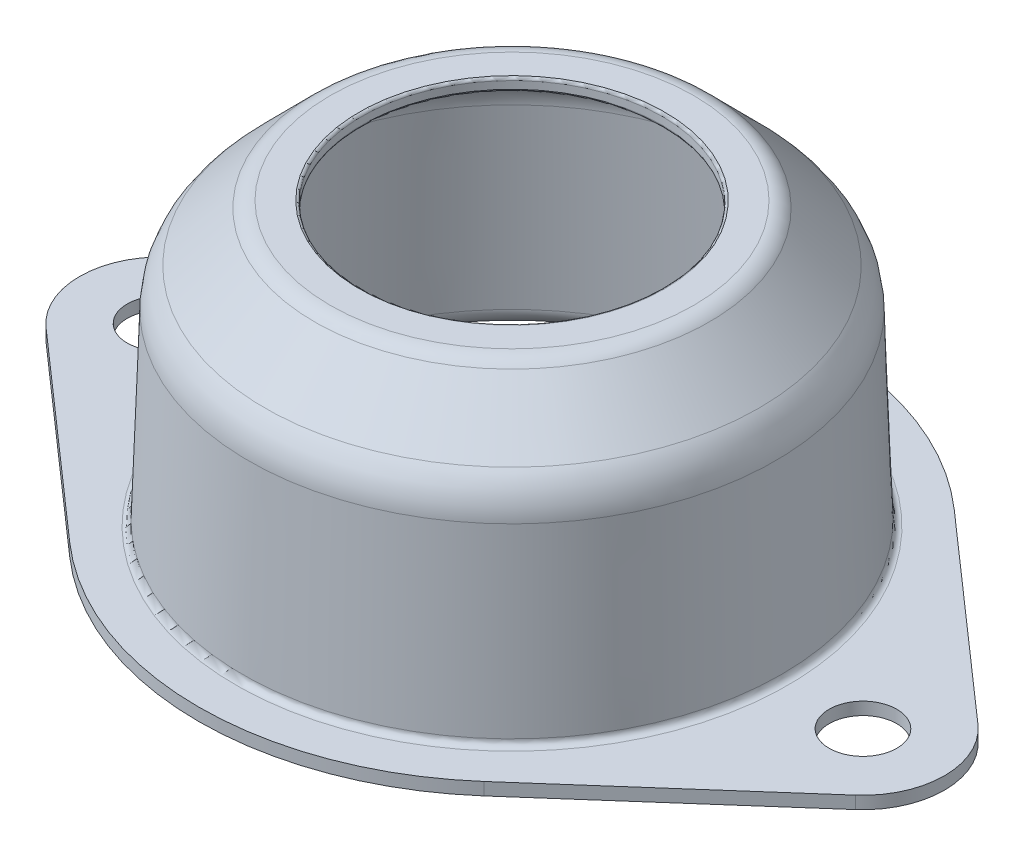
ISO-10303-21;
HEADER;
FILE_DESCRIPTION(('STEP AP214'),'2;1');
FILE_NAME('part.step','',(''),(''),'','','');
FILE_SCHEMA(('AUTOMOTIVE_DESIGN { 1 0 10303 214 1 1 1 1 }'));
ENDSEC;
DATA;
#1=APPLICATION_CONTEXT('core data for automotive mechanical design processes');
#2=APPLICATION_PROTOCOL_DEFINITION('international standard','automotive_design',2000,#1);
#3=PRODUCT_CONTEXT('',#1,'mechanical');
#4=PRODUCT('Part','Part','',(#3));
#5=PRODUCT_RELATED_PRODUCT_CATEGORY('part','',(#4));
#6=PRODUCT_DEFINITION_FORMATION('','',#4);
#7=PRODUCT_DEFINITION_CONTEXT('part definition',#1,'design');
#8=PRODUCT_DEFINITION('design','',#6,#7);
#9=PRODUCT_DEFINITION_SHAPE('','',#8);
#10=(LENGTH_UNIT() NAMED_UNIT(*) SI_UNIT(.MILLI.,.METRE.));
#11=(NAMED_UNIT(*) PLANE_ANGLE_UNIT() SI_UNIT($,.RADIAN.));
#12=(NAMED_UNIT(*) SI_UNIT($,.STERADIAN.) SOLID_ANGLE_UNIT());
#13=UNCERTAINTY_MEASURE_WITH_UNIT(LENGTH_MEASURE(1.E-05),#10,'distance_accuracy_value','');
#14=(GEOMETRIC_REPRESENTATION_CONTEXT(3) GLOBAL_UNCERTAINTY_ASSIGNED_CONTEXT((#13)) GLOBAL_UNIT_ASSIGNED_CONTEXT((#10,
#11,#12)) REPRESENTATION_CONTEXT('',''));
#15=CARTESIAN_POINT('',(0.,0.,0.));
#16=DIRECTION('',(0.,0.,1.));
#17=DIRECTION('',(1.,0.,0.));
#18=AXIS2_PLACEMENT_3D('',#15,#16,#17);
#19=CARTESIAN_POINT('',(0.,1.,0.));
#20=DIRECTION('',(0.,1.,0.));
#21=DIRECTION('',(0.,0.,1.));
#22=AXIS2_PLACEMENT_3D('',#19,#20,#21);
#23=PLANE('',#22);
#24=CARTESIAN_POINT('',(0.,1.,0.));
#25=DIRECTION('',(0.,1.,0.));
#26=DIRECTION('',(-1.,0.,0.));
#27=AXIS2_PLACEMENT_3D('',#24,#25,#26);
#28=CIRCLE('',#27,22.0000000000001);
#29=CARTESIAN_POINT('',(-22.0000000000001,0.999999999999997,0.));
#30=VERTEX_POINT('',#29);
#31=EDGE_CURVE('E199',#30,#30,#28,.T.);
#32=ORIENTED_EDGE('',*,*,#31,.F.);
#33=EDGE_LOOP('',(#32));
#34=FACE_BOUND('',#33,.T.);
#35=CARTESIAN_POINT('',(-28.,1.,0.));
#36=DIRECTION('',(0.,1.,0.));
#37=DIRECTION('',(0.,0.,1.));
#38=AXIS2_PLACEMENT_3D('',#35,#36,#37);
#39=CIRCLE('',#38,2.7);
#40=CARTESIAN_POINT('',(-28.,1.,2.7));
#41=VERTEX_POINT('',#40);
#42=EDGE_CURVE('E163',#41,#41,#39,.T.);
#43=ORIENTED_EDGE('',*,*,#42,.F.);
#44=EDGE_LOOP('',(#43));
#45=FACE_BOUND('',#44,.T.);
#46=CARTESIAN_POINT('',(0.,1.,0.));
#47=DIRECTION('',(0.,1.,0.));
#48=DIRECTION('',(0.,0.,1.));
#49=AXIS2_PLACEMENT_3D('',#46,#47,#48);
#50=CIRCLE('',#49,25.);
#51=CARTESIAN_POINT('',(16.5178571428571,1.,-18.7659371044497));
#52=VERTEX_POINT('',#51);
#53=CARTESIAN_POINT('',(-16.5178571428571,1.,-18.7659371044497));
#54=VERTEX_POINT('',#53);
#55=EDGE_CURVE('E180',#52,#54,#50,.T.);
#56=ORIENTED_EDGE('',*,*,#55,.T.);
#57=DIRECTION('',(-0.75063748417799,0.,0.660714285714285));
#58=VECTOR('',#57,1.);
#59=CARTESIAN_POINT('',(-16.5178571428571,1.,-18.7659371044497));
#60=LINE('',#59,#58);
#61=CARTESIAN_POINT('',(-32.2946428571429,1.,-4.87914364715695));
#62=VERTEX_POINT('',#61);
#63=EDGE_CURVE('E114',#54,#62,#60,.T.);
#64=ORIENTED_EDGE('',*,*,#63,.T.);
#65=CARTESIAN_POINT('',(-28.,1.,0.));
#66=DIRECTION('',(0.,1.,0.));
#67=DIRECTION('',(0.,0.,1.));
#68=AXIS2_PLACEMENT_3D('',#65,#66,#67);
#69=CIRCLE('',#68,6.50000000000002);
#70=CARTESIAN_POINT('',(-32.2946428571429,1.,4.87914364715695));
#71=VERTEX_POINT('',#70);
#72=EDGE_CURVE('E277',#62,#71,#69,.T.);
#73=ORIENTED_EDGE('',*,*,#72,.T.);
#74=DIRECTION('',(0.75063748417799,0.,0.660714285714285));
#75=VECTOR('',#74,1.);
#76=CARTESIAN_POINT('',(-32.2946428571429,1.,4.87914364715695));
#77=LINE('',#76,#75);
#78=CARTESIAN_POINT('',(-16.5178571428571,1.,18.7659371044497));
#79=VERTEX_POINT('',#78);
#80=EDGE_CURVE('E280',#71,#79,#77,.T.);
#81=ORIENTED_EDGE('',*,*,#80,.T.);
#82=CARTESIAN_POINT('',(0.,1.,0.));
#83=DIRECTION('',(0.,1.,0.));
#84=DIRECTION('',(0.,0.,1.));
#85=AXIS2_PLACEMENT_3D('',#82,#83,#84);
#86=CIRCLE('',#85,25.);
#87=CARTESIAN_POINT('',(16.5178571428571,1.,18.7659371044497));
#88=VERTEX_POINT('',#87);
#89=EDGE_CURVE('E136',#79,#88,#86,.T.);
#90=ORIENTED_EDGE('',*,*,#89,.T.);
#91=DIRECTION('',(0.75063748417799,0.,-0.660714285714285));
#92=VECTOR('',#91,1.);
#93=CARTESIAN_POINT('',(16.5178571428571,1.,18.7659371044497));
#94=LINE('',#93,#92);
#95=CARTESIAN_POINT('',(32.2946428571429,1.,4.87914364715695));
#96=VERTEX_POINT('',#95);
#97=EDGE_CURVE('E130',#88,#96,#94,.T.);
#98=ORIENTED_EDGE('',*,*,#97,.T.);
#99=CARTESIAN_POINT('',(28.,1.,0.));
#100=DIRECTION('',(0.,1.,0.));
#101=DIRECTION('',(0.,0.,-1.));
#102=AXIS2_PLACEMENT_3D('',#99,#100,#101);
#103=CIRCLE('',#102,6.50000000000002);
#104=CARTESIAN_POINT('',(32.2946428571429,1.,-4.87914364715695));
#105=VERTEX_POINT('',#104);
#106=EDGE_CURVE('E134',#96,#105,#103,.T.);
#107=ORIENTED_EDGE('',*,*,#106,.T.);
#108=DIRECTION('',(-0.75063748417799,0.,-0.660714285714285));
#109=VECTOR('',#108,1.);
#110=CARTESIAN_POINT('',(32.2946428571429,1.,-4.87914364715695));
#111=LINE('',#110,#109);
#112=EDGE_CURVE('E66',#105,#52,#111,.T.);
#113=ORIENTED_EDGE('',*,*,#112,.T.);
#114=EDGE_LOOP('',(#56,#64,#73,#81,#90,#98,#107,#113));
#115=FACE_BOUND('',#114,.T.);
#116=CARTESIAN_POINT('',(28.,1.,0.));
#117=DIRECTION('',(0.,1.,0.));
#118=DIRECTION('',(0.,0.,1.));
#119=AXIS2_PLACEMENT_3D('',#116,#117,#118);
#120=CIRCLE('',#119,2.7);
#121=CARTESIAN_POINT('',(28.,1.,2.7));
#122=VERTEX_POINT('',#121);
#123=EDGE_CURVE('E259',#122,#122,#120,.T.);
#124=ORIENTED_EDGE('',*,*,#123,.F.);
#125=EDGE_LOOP('',(#124));
#126=FACE_BOUND('',#125,.T.);
#127=ADVANCED_FACE('F45',(#34,#45,#115,#126),#23,.T.);
#128=CARTESIAN_POINT('',(0.,0.,0.));
#129=DIRECTION('',(0.,1.,0.));
#130=DIRECTION('',(0.,0.,1.));
#131=AXIS2_PLACEMENT_3D('',#128,#129,#130);
#132=PLANE('',#131);
#133=CARTESIAN_POINT('',(0.,0.,0.));
#134=DIRECTION('',(0.,-1.,0.));
#135=DIRECTION('',(0.,0.,-1.));
#136=AXIS2_PLACEMENT_3D('',#133,#134,#135);
#137=CIRCLE('',#136,22.0000000000001);
#138=CARTESIAN_POINT('',(0.,0.,-22.0000000000001));
#139=VERTEX_POINT('',#138);
#140=EDGE_CURVE('E377',#139,#139,#137,.T.);
#141=ORIENTED_EDGE('',*,*,#140,.F.);
#142=EDGE_LOOP('',(#141));
#143=FACE_BOUND('',#142,.T.);
#144=CARTESIAN_POINT('',(0.,0.,0.));
#145=DIRECTION('',(0.,1.,0.));
#146=DIRECTION('',(0.,0.,1.));
#147=AXIS2_PLACEMENT_3D('',#144,#145,#146);
#148=CIRCLE('',#147,25.);
#149=CARTESIAN_POINT('',(16.5178571428571,0.,-18.7659371044497));
#150=VERTEX_POINT('',#149);
#151=CARTESIAN_POINT('',(-16.5178571428571,0.,-18.7659371044497));
#152=VERTEX_POINT('',#151);
#153=EDGE_CURVE('E158',#150,#152,#148,.T.);
#154=ORIENTED_EDGE('',*,*,#153,.F.);
#155=DIRECTION('',(-0.75063748417799,0.,-0.660714285714285));
#156=VECTOR('',#155,1.);
#157=CARTESIAN_POINT('',(32.2946428571429,0.,-4.87914364715695));
#158=LINE('',#157,#156);
#159=CARTESIAN_POINT('',(32.2946428571429,0.,-4.87914364715695));
#160=VERTEX_POINT('',#159);
#161=EDGE_CURVE('E105',#160,#150,#158,.T.);
#162=ORIENTED_EDGE('',*,*,#161,.F.);
#163=CARTESIAN_POINT('',(28.,0.,0.));
#164=DIRECTION('',(0.,1.,0.));
#165=DIRECTION('',(0.,0.,-1.));
#166=AXIS2_PLACEMENT_3D('',#163,#164,#165);
#167=CIRCLE('',#166,6.50000000000002);
#168=CARTESIAN_POINT('',(32.2946428571429,0.,4.87914364715695));
#169=VERTEX_POINT('',#168);
#170=EDGE_CURVE('E99',#169,#160,#167,.T.);
#171=ORIENTED_EDGE('',*,*,#170,.F.);
#172=DIRECTION('',(0.75063748417799,0.,-0.660714285714285));
#173=VECTOR('',#172,1.);
#174=CARTESIAN_POINT('',(16.5178571428571,0.,18.7659371044497));
#175=LINE('',#174,#173);
#176=CARTESIAN_POINT('',(16.5178571428571,0.,18.7659371044497));
#177=VERTEX_POINT('',#176);
#178=EDGE_CURVE('E145',#177,#169,#175,.T.);
#179=ORIENTED_EDGE('',*,*,#178,.F.);
#180=CARTESIAN_POINT('',(0.,0.,0.));
#181=DIRECTION('',(0.,1.,0.));
#182=DIRECTION('',(0.,0.,1.));
#183=AXIS2_PLACEMENT_3D('',#180,#181,#182);
#184=CIRCLE('',#183,25.);
#185=CARTESIAN_POINT('',(-16.5178571428571,0.,18.7659371044497));
#186=VERTEX_POINT('',#185);
#187=EDGE_CURVE('E171',#186,#177,#184,.T.);
#188=ORIENTED_EDGE('',*,*,#187,.F.);
#189=DIRECTION('',(0.75063748417799,0.,0.660714285714285));
#190=VECTOR('',#189,1.);
#191=CARTESIAN_POINT('',(-32.2946428571429,0.,4.87914364715695));
#192=LINE('',#191,#190);
#193=CARTESIAN_POINT('',(-32.2946428571429,0.,4.87914364715695));
#194=VERTEX_POINT('',#193);
#195=EDGE_CURVE('E169',#194,#186,#192,.T.);
#196=ORIENTED_EDGE('',*,*,#195,.F.);
#197=CARTESIAN_POINT('',(-28.,0.,0.));
#198=DIRECTION('',(0.,1.,0.));
#199=DIRECTION('',(0.,0.,1.));
#200=AXIS2_PLACEMENT_3D('',#197,#198,#199);
#201=CIRCLE('',#200,6.50000000000002);
#202=CARTESIAN_POINT('',(-32.2946428571429,0.,-4.87914364715695));
#203=VERTEX_POINT('',#202);
#204=EDGE_CURVE('E166',#203,#194,#201,.T.);
#205=ORIENTED_EDGE('',*,*,#204,.F.);
#206=DIRECTION('',(-0.75063748417799,0.,0.660714285714285));
#207=VECTOR('',#206,1.);
#208=CARTESIAN_POINT('',(-16.5178571428571,0.,-18.7659371044497));
#209=LINE('',#208,#207);
#210=EDGE_CURVE('E162',#152,#203,#209,.T.);
#211=ORIENTED_EDGE('',*,*,#210,.F.);
#212=EDGE_LOOP('',(#154,#162,#171,#179,#188,#196,#205,#211));
#213=FACE_BOUND('',#212,.T.);
#214=CARTESIAN_POINT('',(-28.,0.,0.));
#215=DIRECTION('',(0.,1.,0.));
#216=DIRECTION('',(0.,0.,1.));
#217=AXIS2_PLACEMENT_3D('',#214,#215,#216);
#218=CIRCLE('',#217,2.7);
#219=CARTESIAN_POINT('',(-28.,0.,2.7));
#220=VERTEX_POINT('',#219);
#221=EDGE_CURVE('E263',#220,#220,#218,.T.);
#222=ORIENTED_EDGE('',*,*,#221,.T.);
#223=EDGE_LOOP('',(#222));
#224=FACE_BOUND('',#223,.T.);
#225=CARTESIAN_POINT('',(28.,0.,0.));
#226=DIRECTION('',(0.,1.,0.));
#227=DIRECTION('',(0.,0.,1.));
#228=AXIS2_PLACEMENT_3D('',#225,#226,#227);
#229=CIRCLE('',#228,2.7);
#230=CARTESIAN_POINT('',(28.,0.,2.7));
#231=VERTEX_POINT('',#230);
#232=EDGE_CURVE('E258',#231,#231,#229,.T.);
#233=ORIENTED_EDGE('',*,*,#232,.T.);
#234=EDGE_LOOP('',(#233));
#235=FACE_BOUND('',#234,.T.);
#236=ADVANCED_FACE('F294',(#143,#213,#224,#235),#132,.F.);
#237=CARTESIAN_POINT('',(0.,1.,0.));
#238=DIRECTION('',(0.,-1.,0.));
#239=DIRECTION('',(0.,0.,-1.));
#240=AXIS2_PLACEMENT_3D('',#237,#238,#239);
#241=CYLINDRICAL_SURFACE('',#240,25.);
#242=ORIENTED_EDGE('',*,*,#153,.T.);
#243=DIRECTION('',(0.,-1.,0.));
#244=VECTOR('',#243,1.);
#245=CARTESIAN_POINT('',(-16.5178571428571,1.,-18.7659371044497));
#246=LINE('',#245,#244);
#247=EDGE_CURVE('E196',#54,#152,#246,.T.);
#248=ORIENTED_EDGE('',*,*,#247,.F.);
#249=ORIENTED_EDGE('',*,*,#55,.F.);
#250=DIRECTION('',(0.,-1.,0.));
#251=VECTOR('',#250,1.);
#252=CARTESIAN_POINT('',(16.5178571428571,1.,-18.7659371044497));
#253=LINE('',#252,#251);
#254=EDGE_CURVE('E154',#52,#150,#253,.T.);
#255=ORIENTED_EDGE('',*,*,#254,.T.);
#256=EDGE_LOOP('',(#242,#248,#249,#255));
#257=FACE_BOUND('',#256,.T.);
#258=ADVANCED_FACE('F299',(#257),#241,.T.);
#259=CARTESIAN_POINT('',(-16.5178571428571,1.,-18.7659371044497));
#260=DIRECTION('',(0.660714285714285,0.,0.75063748417799));
#261=DIRECTION('',(0.75063748417799,0.,-0.660714285714285));
#262=AXIS2_PLACEMENT_3D('',#259,#260,#261);
#263=PLANE('',#262);
#264=ORIENTED_EDGE('',*,*,#210,.T.);
#265=DIRECTION('',(0.,-1.,0.));
#266=VECTOR('',#265,1.);
#267=CARTESIAN_POINT('',(-32.2946428571429,1.,-4.87914364715695));
#268=LINE('',#267,#266);
#269=EDGE_CURVE('E192',#62,#203,#268,.T.);
#270=ORIENTED_EDGE('',*,*,#269,.F.);
#271=ORIENTED_EDGE('',*,*,#63,.F.);
#272=ORIENTED_EDGE('',*,*,#247,.T.);
#273=EDGE_LOOP('',(#264,#270,#271,#272));
#274=FACE_BOUND('',#273,.T.);
#275=ADVANCED_FACE('F555',(#274),#263,.F.);
#276=CARTESIAN_POINT('',(-28.,1.,0.));
#277=DIRECTION('',(0.,-1.,0.));
#278=DIRECTION('',(0.,0.,-1.));
#279=AXIS2_PLACEMENT_3D('',#276,#277,#278);
#280=CYLINDRICAL_SURFACE('',#279,6.50000000000002);
#281=ORIENTED_EDGE('',*,*,#204,.T.);
#282=DIRECTION('',(0.,-1.,0.));
#283=VECTOR('',#282,1.);
#284=CARTESIAN_POINT('',(-32.2946428571429,1.,4.87914364715695));
#285=LINE('',#284,#283);
#286=EDGE_CURVE('E189',#71,#194,#285,.T.);
#287=ORIENTED_EDGE('',*,*,#286,.F.);
#288=ORIENTED_EDGE('',*,*,#72,.F.);
#289=ORIENTED_EDGE('',*,*,#269,.T.);
#290=EDGE_LOOP('',(#281,#287,#288,#289));
#291=FACE_BOUND('',#290,.T.);
#292=ADVANCED_FACE('F546',(#291),#280,.T.);
#293=CARTESIAN_POINT('',(-32.2946428571429,1.,4.87914364715695));
#294=DIRECTION('',(0.660714285714285,0.,-0.75063748417799));
#295=DIRECTION('',(-0.75063748417799,0.,-0.660714285714285));
#296=AXIS2_PLACEMENT_3D('',#293,#294,#295);
#297=PLANE('',#296);
#298=ORIENTED_EDGE('',*,*,#195,.T.);
#299=DIRECTION('',(0.,-1.,0.));
#300=VECTOR('',#299,1.);
#301=CARTESIAN_POINT('',(-16.5178571428571,1.,18.7659371044497));
#302=LINE('',#301,#300);
#303=EDGE_CURVE('E186',#79,#186,#302,.T.);
#304=ORIENTED_EDGE('',*,*,#303,.F.);
#305=ORIENTED_EDGE('',*,*,#80,.F.);
#306=ORIENTED_EDGE('',*,*,#286,.T.);
#307=EDGE_LOOP('',(#298,#304,#305,#306));
#308=FACE_BOUND('',#307,.T.);
#309=ADVANCED_FACE('F287',(#308),#297,.F.);
#310=CARTESIAN_POINT('',(0.,1.,0.));
#311=DIRECTION('',(0.,-1.,0.));
#312=DIRECTION('',(0.,0.,-1.));
#313=AXIS2_PLACEMENT_3D('',#310,#311,#312);
#314=CYLINDRICAL_SURFACE('',#313,25.);
#315=ORIENTED_EDGE('',*,*,#187,.T.);
#316=DIRECTION('',(0.,-1.,0.));
#317=VECTOR('',#316,1.);
#318=CARTESIAN_POINT('',(16.5178571428571,1.,18.7659371044497));
#319=LINE('',#318,#317);
#320=EDGE_CURVE('E147',#88,#177,#319,.T.);
#321=ORIENTED_EDGE('',*,*,#320,.F.);
#322=ORIENTED_EDGE('',*,*,#89,.F.);
#323=ORIENTED_EDGE('',*,*,#303,.T.);
#324=EDGE_LOOP('',(#315,#321,#322,#323));
#325=FACE_BOUND('',#324,.T.);
#326=ADVANCED_FACE('F291',(#325),#314,.T.);
#327=CARTESIAN_POINT('',(16.5178571428571,1.,18.7659371044497));
#328=DIRECTION('',(-0.660714285714285,0.,-0.75063748417799));
#329=DIRECTION('',(-0.75063748417799,0.,0.660714285714285));
#330=AXIS2_PLACEMENT_3D('',#327,#328,#329);
#331=PLANE('',#330);
#332=ORIENTED_EDGE('',*,*,#178,.T.);
#333=DIRECTION('',(0.,-1.,0.));
#334=VECTOR('',#333,1.);
#335=CARTESIAN_POINT('',(32.2946428571429,1.,4.87914364715695));
#336=LINE('',#335,#334);
#337=EDGE_CURVE('E142',#96,#169,#336,.T.);
#338=ORIENTED_EDGE('',*,*,#337,.F.);
#339=ORIENTED_EDGE('',*,*,#97,.F.);
#340=ORIENTED_EDGE('',*,*,#320,.T.);
#341=EDGE_LOOP('',(#332,#338,#339,#340));
#342=FACE_BOUND('',#341,.T.);
#343=ADVANCED_FACE('F143',(#342),#331,.F.);
#344=CARTESIAN_POINT('',(28.,1.,0.));
#345=DIRECTION('',(0.,-1.,0.));
#346=DIRECTION('',(0.,0.,-1.));
#347=AXIS2_PLACEMENT_3D('',#344,#345,#346);
#348=CYLINDRICAL_SURFACE('',#347,6.50000000000002);
#349=ORIENTED_EDGE('',*,*,#170,.T.);
#350=DIRECTION('',(0.,-1.,0.));
#351=VECTOR('',#350,1.);
#352=CARTESIAN_POINT('',(32.2946428571429,1.,-4.87914364715695));
#353=LINE('',#352,#351);
#354=EDGE_CURVE('E148',#105,#160,#353,.T.);
#355=ORIENTED_EDGE('',*,*,#354,.F.);
#356=ORIENTED_EDGE('',*,*,#106,.F.);
#357=ORIENTED_EDGE('',*,*,#337,.T.);
#358=EDGE_LOOP('',(#349,#355,#356,#357));
#359=FACE_BOUND('',#358,.T.);
#360=ADVANCED_FACE('F150',(#359),#348,.T.);
#361=CARTESIAN_POINT('',(32.2946428571429,1.,-4.87914364715695));
#362=DIRECTION('',(-0.660714285714285,0.,0.75063748417799));
#363=DIRECTION('',(0.75063748417799,0.,0.660714285714285));
#364=AXIS2_PLACEMENT_3D('',#361,#362,#363);
#365=PLANE('',#364);
#366=ORIENTED_EDGE('',*,*,#161,.T.);
#367=ORIENTED_EDGE('',*,*,#254,.F.);
#368=ORIENTED_EDGE('',*,*,#112,.F.);
#369=ORIENTED_EDGE('',*,*,#354,.T.);
#370=EDGE_LOOP('',(#366,#367,#368,#369));
#371=FACE_BOUND('',#370,.T.);
#372=ADVANCED_FACE('F301',(#371),#365,.F.);
#373=CARTESIAN_POINT('',(-28.,1.,0.));
#374=DIRECTION('',(0.,-1.,0.));
#375=DIRECTION('',(0.,0.,-1.));
#376=AXIS2_PLACEMENT_3D('',#373,#374,#375);
#377=CYLINDRICAL_SURFACE('',#376,2.7);
#378=ORIENTED_EDGE('',*,*,#42,.T.);
#379=EDGE_LOOP('',(#378));
#380=FACE_BOUND('',#379,.T.);
#381=ORIENTED_EDGE('',*,*,#221,.F.);
#382=EDGE_LOOP('',(#381));
#383=FACE_BOUND('',#382,.T.);
#384=ADVANCED_FACE('F303',(#380,#383),#377,.F.);
#385=CARTESIAN_POINT('',(28.,1.,0.));
#386=DIRECTION('',(0.,-1.,0.));
#387=DIRECTION('',(0.,0.,-1.));
#388=AXIS2_PLACEMENT_3D('',#385,#386,#387);
#389=CYLINDRICAL_SURFACE('',#388,2.7);
#390=ORIENTED_EDGE('',*,*,#123,.T.);
#391=EDGE_LOOP('',(#390));
#392=FACE_BOUND('',#391,.T.);
#393=ORIENTED_EDGE('',*,*,#232,.F.);
#394=EDGE_LOOP('',(#393));
#395=FACE_BOUND('',#394,.T.);
#396=ADVANCED_FACE('F309',(#392,#395),#389,.F.);
#397=CARTESIAN_POINT('',(0.,1.5,0.));
#398=DIRECTION('',(0.,1.,0.));
#399=DIRECTION('',(-1.,0.,0.));
#400=AXIS2_PLACEMENT_3D('',#397,#398,#399);
#401=TOROIDAL_SURFACE('',#400,22.0000000000001,0.499999999999996);
#402=CARTESIAN_POINT('',(0.,1.49999999999999,0.));
#403=DIRECTION('',(0.,1.,0.));
#404=DIRECTION('',(-1.,0.,0.));
#405=AXIS2_PLACEMENT_3D('',#402,#403,#404);
#406=CIRCLE('',#405,21.5000000000001);
#407=CARTESIAN_POINT('',(-21.5000000000001,1.49999999999999,0.));
#408=VERTEX_POINT('',#407);
#409=EDGE_CURVE('E254',#408,#408,#406,.T.);
#410=ORIENTED_EDGE('',*,*,#409,.F.);
#411=EDGE_LOOP('',(#410));
#412=FACE_BOUND('',#411,.T.);
#413=ORIENTED_EDGE('',*,*,#31,.T.);
#414=EDGE_LOOP('',(#413));
#415=FACE_BOUND('',#414,.T.);
#416=ADVANCED_FACE('F326',(#412,#415),#401,.F.);
#417=CARTESIAN_POINT('',(0.,1.49999999999999,0.));
#418=DIRECTION('',(0.,-1.,0.));
#419=DIRECTION('',(1.,0.,0.));
#420=AXIS2_PLACEMENT_3D('',#417,#418,#419);
#421=CONICAL_SURFACE('',#420,21.5000000000001,0.0344691009995078);
#422=CARTESIAN_POINT('',(0.,16.,0.));
#423=DIRECTION('',(0.,1.,0.));
#424=DIRECTION('',(-1.,0.,0.));
#425=AXIS2_PLACEMENT_3D('',#422,#423,#424);
#426=CIRCLE('',#425,21.0000000000001);
#427=CARTESIAN_POINT('',(-21.0000000000001,16.,0.));
#428=VERTEX_POINT('',#427);
#429=EDGE_CURVE('E250',#428,#428,#426,.T.);
#430=ORIENTED_EDGE('',*,*,#429,.F.);
#431=EDGE_LOOP('',(#430));
#432=FACE_BOUND('',#431,.T.);
#433=ORIENTED_EDGE('',*,*,#409,.T.);
#434=EDGE_LOOP('',(#433));
#435=FACE_BOUND('',#434,.T.);
#436=ADVANCED_FACE('F330',(#432,#435),#421,.T.);
#437=CARTESIAN_POINT('',(0.,15.8457399045786,0.));
#438=DIRECTION('',(0.,1.,0.));
#439=DIRECTION('',(-1.,0.,0.));
#440=AXIS2_PLACEMENT_3D('',#437,#438,#439);
#441=TOROIDAL_SURFACE('',#440,16.5264572327801,4.47620163388395);
#442=CARTESIAN_POINT('',(0.,19.,0.));
#443=DIRECTION('',(0.,1.,0.));
#444=DIRECTION('',(-1.,0.,0.));
#445=AXIS2_PLACEMENT_3D('',#442,#443,#444);
#446=CIRCLE('',#445,19.7024648394488);
#447=CARTESIAN_POINT('',(-19.7024648394488,19.,0.));
#448=VERTEX_POINT('',#447);
#449=EDGE_CURVE('E239',#448,#448,#446,.T.);
#450=ORIENTED_EDGE('',*,*,#449,.F.);
#451=EDGE_LOOP('',(#450));
#452=FACE_BOUND('',#451,.T.);
#453=ORIENTED_EDGE('',*,*,#429,.T.);
#454=EDGE_LOOP('',(#453));
#455=FACE_BOUND('',#454,.T.);
#456=ADVANCED_FACE('F334',(#452,#455),#441,.T.);
#457=CARTESIAN_POINT('',(0.,19.,0.));
#458=DIRECTION('',(0.,-1.,0.));
#459=DIRECTION('',(1.,0.,0.));
#460=AXIS2_PLACEMENT_3D('',#457,#458,#459);
#461=CONICAL_SURFACE('',#460,19.7024648394488,0.781962696413601);
#462=CARTESIAN_POINT('',(0.,22.9797156909799,0.));
#463=DIRECTION('',(0.,1.,0.));
#464=DIRECTION('',(-1.,0.,0.));
#465=AXIS2_PLACEMENT_3D('',#462,#463,#464);
#466=CIRCLE('',#465,15.75);
#467=CARTESIAN_POINT('',(-15.75,22.9797156909799,0.));
#468=VERTEX_POINT('',#467);
#469=EDGE_CURVE('E234',#468,#468,#466,.T.);
#470=ORIENTED_EDGE('',*,*,#469,.F.);
#471=EDGE_LOOP('',(#470));
#472=FACE_BOUND('',#471,.T.);
#473=ORIENTED_EDGE('',*,*,#449,.T.);
#474=EDGE_LOOP('',(#473));
#475=FACE_BOUND('',#474,.T.);
#476=ADVANCED_FACE('F338',(#472,#475),#461,.T.);
#477=CARTESIAN_POINT('',(0.,21.7382749869344,0.));
#478=DIRECTION('',(0.,1.,0.));
#479=DIRECTION('',(-1.,0.,0.));
#480=AXIS2_PLACEMENT_3D('',#477,#478,#479);
#481=TOROIDAL_SURFACE('',#480,14.5,1.76172501306561);
#482=CARTESIAN_POINT('',(0.,23.5,0.));
#483=DIRECTION('',(0.,1.,0.));
#484=DIRECTION('',(-1.,0.,0.));
#485=AXIS2_PLACEMENT_3D('',#482,#483,#484);
#486=CIRCLE('',#485,14.5);
#487=CARTESIAN_POINT('',(-14.5,23.5,0.));
#488=VERTEX_POINT('',#487);
#489=EDGE_CURVE('E231',#488,#488,#486,.T.);
#490=ORIENTED_EDGE('',*,*,#489,.F.);
#491=EDGE_LOOP('',(#490));
#492=FACE_BOUND('',#491,.T.);
#493=ORIENTED_EDGE('',*,*,#469,.T.);
#494=EDGE_LOOP('',(#493));
#495=FACE_BOUND('',#494,.T.);
#496=ADVANCED_FACE('F227',(#492,#495),#481,.T.);
#497=CARTESIAN_POINT('',(-14.5,23.5,1.01252958826451E-13));
#498=DIRECTION('',(0.,-1.,0.));
#499=DIRECTION('',(1.,0.,0.));
#500=AXIS2_PLACEMENT_3D('',#497,#498,#499);
#501=PLANE('',#500);
#502=CARTESIAN_POINT('',(0.,23.5,0.));
#503=DIRECTION('',(0.,-1.,0.));
#504=DIRECTION('',(1.,0.,0.));
#505=AXIS2_PLACEMENT_3D('',#502,#503,#504);
#506=CIRCLE('',#505,12.2);
#507=CARTESIAN_POINT('',(12.2,23.5,0.));
#508=VERTEX_POINT('',#507);
#509=EDGE_CURVE('E203',#508,#508,#506,.T.);
#510=ORIENTED_EDGE('',*,*,#509,.T.);
#511=EDGE_LOOP('',(#510));
#512=FACE_BOUND('',#511,.T.);
#513=ORIENTED_EDGE('',*,*,#489,.T.);
#514=EDGE_LOOP('',(#513));
#515=FACE_BOUND('',#514,.T.);
#516=ADVANCED_FACE('F223',(#512,#515),#501,.F.);
#517=CARTESIAN_POINT('',(0.,21.7382749869344,0.));
#518=DIRECTION('',(0.,-1.,0.));
#519=DIRECTION('',(0.,0.,-1.));
#520=AXIS2_PLACEMENT_3D('',#517,#518,#519);
#521=TOROIDAL_SURFACE('',#520,14.5,0.761725013065611);
#522=CARTESIAN_POINT('',(0.,22.2750423198019,0.));
#523=DIRECTION('',(0.,-1.,0.));
#524=DIRECTION('',(0.,0.,-1.));
#525=AXIS2_PLACEMENT_3D('',#522,#523,#524);
#526=CIRCLE('',#525,15.0404681543774);
#527=CARTESIAN_POINT('',(0.,22.2750423198019,-15.0404681543774));
#528=VERTEX_POINT('',#527);
#529=EDGE_CURVE('E235',#528,#528,#526,.T.);
#530=ORIENTED_EDGE('',*,*,#529,.T.);
#531=EDGE_LOOP('',(#530));
#532=FACE_BOUND('',#531,.T.);
#533=CARTESIAN_POINT('',(0.,22.5,0.));
#534=DIRECTION('',(0.,-1.,0.));
#535=DIRECTION('',(0.,0.,-1.));
#536=AXIS2_PLACEMENT_3D('',#533,#534,#535);
#537=CIRCLE('',#536,14.5);
#538=CARTESIAN_POINT('',(0.,22.5,-14.5));
#539=VERTEX_POINT('',#538);
#540=EDGE_CURVE('E374',#539,#539,#537,.T.);
#541=ORIENTED_EDGE('',*,*,#540,.F.);
#542=EDGE_LOOP('',(#541));
#543=FACE_BOUND('',#542,.T.);
#544=ADVANCED_FACE('F226',(#532,#543),#521,.F.);
#545=CARTESIAN_POINT('',(0.,22.2750423198019,0.));
#546=DIRECTION('',(0.,-1.,0.));
#547=DIRECTION('',(0.,0.,-1.));
#548=AXIS2_PLACEMENT_3D('',#545,#546,#547);
#549=CONICAL_SURFACE('',#548,15.0404681543774,0.781962696413601);
#550=CARTESIAN_POINT('',(0.,18.295326628822,0.));
#551=DIRECTION('',(0.,-1.,0.));
#552=DIRECTION('',(0.,0.,-1.));
#553=AXIS2_PLACEMENT_3D('',#550,#551,#552);
#554=CIRCLE('',#553,18.9929329938262);
#555=CARTESIAN_POINT('',(0.,18.295326628822,-18.9929329938262));
#556=VERTEX_POINT('',#555);
#557=EDGE_CURVE('E243',#556,#556,#554,.T.);
#558=ORIENTED_EDGE('',*,*,#557,.T.);
#559=EDGE_LOOP('',(#558));
#560=FACE_BOUND('',#559,.T.);
#561=ORIENTED_EDGE('',*,*,#529,.F.);
#562=EDGE_LOOP('',(#561));
#563=FACE_BOUND('',#562,.T.);
#564=ADVANCED_FACE('F347',(#560,#563),#549,.F.);
#565=CARTESIAN_POINT('',(0.,15.8457399045786,0.));
#566=DIRECTION('',(0.,-1.,0.));
#567=DIRECTION('',(0.,0.,-1.));
#568=AXIS2_PLACEMENT_3D('',#565,#566,#567);
#569=TOROIDAL_SURFACE('',#568,16.5264572327801,3.47620163388395);
#570=CARTESIAN_POINT('',(0.,15.9655377241602,0.));
#571=DIRECTION('',(0.,-1.,0.));
#572=DIRECTION('',(0.,0.,-1.));
#573=AXIS2_PLACEMENT_3D('',#570,#571,#572);
#574=CIRCLE('',#573,20.0005940006465);
#575=CARTESIAN_POINT('',(0.,15.9655377241602,-20.0005940006465));
#576=VERTEX_POINT('',#575);
#577=EDGE_CURVE('E387',#576,#576,#574,.T.);
#578=ORIENTED_EDGE('',*,*,#577,.T.);
#579=EDGE_LOOP('',(#578));
#580=FACE_BOUND('',#579,.T.);
#581=ORIENTED_EDGE('',*,*,#557,.F.);
#582=EDGE_LOOP('',(#581));
#583=FACE_BOUND('',#582,.T.);
#584=ADVANCED_FACE('F351',(#580,#583),#569,.F.);
#585=CARTESIAN_POINT('',(0.,15.9655377241602,0.));
#586=DIRECTION('',(0.,-1.,0.));
#587=DIRECTION('',(0.,0.,-1.));
#588=AXIS2_PLACEMENT_3D('',#585,#586,#587);
#589=CONICAL_SURFACE('',#588,20.0005940006465,0.0344691009995077);
#590=CARTESIAN_POINT('',(0.,1.47814725347956,0.));
#591=DIRECTION('',(0.,-1.,0.));
#592=DIRECTION('',(0.,0.,-1.));
#593=AXIS2_PLACEMENT_3D('',#590,#591,#592);
#594=CIRCLE('',#593,20.5001591892906);
#595=CARTESIAN_POINT('',(0.,1.47814725347956,-20.5001591892906));
#596=VERTEX_POINT('',#595);
#597=EDGE_CURVE('E381',#596,#596,#594,.T.);
#598=ORIENTED_EDGE('',*,*,#597,.T.);
#599=EDGE_LOOP('',(#598));
#600=FACE_BOUND('',#599,.T.);
#601=ORIENTED_EDGE('',*,*,#577,.F.);
#602=EDGE_LOOP('',(#601));
#603=FACE_BOUND('',#602,.T.);
#604=ADVANCED_FACE('F355',(#600,#603),#589,.F.);
#605=CARTESIAN_POINT('',(0.,1.49999999999999,0.));
#606=DIRECTION('',(0.,-1.,0.));
#607=DIRECTION('',(0.,0.,-1.));
#608=AXIS2_PLACEMENT_3D('',#605,#606,#607);
#609=TOROIDAL_SURFACE('',#608,22.0000000000001,1.5);
#610=ORIENTED_EDGE('',*,*,#140,.T.);
#611=EDGE_LOOP('',(#610));
#612=FACE_BOUND('',#611,.T.);
#613=ORIENTED_EDGE('',*,*,#597,.F.);
#614=EDGE_LOOP('',(#613));
#615=FACE_BOUND('',#614,.T.);
#616=ADVANCED_FACE('F359',(#612,#615),#609,.T.);
#617=CARTESIAN_POINT('',(0.,0.,0.));
#618=DIRECTION('',(0.,-1.,0.));
#619=DIRECTION('',(0.,0.,-1.));
#620=AXIS2_PLACEMENT_3D('',#617,#618,#619);
#621=CYLINDRICAL_SURFACE('',#620,12.);
#622=CARTESIAN_POINT('',(0.,23.3,0.));
#623=DIRECTION('',(0.,-1.,0.));
#624=DIRECTION('',(1.,0.,0.));
#625=AXIS2_PLACEMENT_3D('',#622,#623,#624);
#626=CIRCLE('',#625,12.);
#627=CARTESIAN_POINT('',(12.,23.3,0.));
#628=VERTEX_POINT('',#627);
#629=EDGE_CURVE('E55',#628,#628,#626,.F.);
#630=ORIENTED_EDGE('',*,*,#629,.T.);
#631=EDGE_LOOP('',(#630));
#632=FACE_BOUND('',#631,.T.);
#633=CARTESIAN_POINT('',(0.,22.7,0.));
#634=DIRECTION('',(0.,-1.,0.));
#635=DIRECTION('',(0.,0.,-1.));
#636=AXIS2_PLACEMENT_3D('',#633,#634,#635);
#637=CIRCLE('',#636,12.);
#638=CARTESIAN_POINT('',(0.,22.7,-12.));
#639=VERTEX_POINT('',#638);
#640=EDGE_CURVE('E207',#639,#639,#637,.T.);
#641=ORIENTED_EDGE('',*,*,#640,.T.);
#642=EDGE_LOOP('',(#641));
#643=FACE_BOUND('',#642,.T.);
#644=ADVANCED_FACE('F214',(#632,#643),#621,.F.);
#645=CARTESIAN_POINT('',(-12.,22.5,0.));
#646=DIRECTION('',(0.,-1.,0.));
#647=DIRECTION('',(0.,0.,-1.));
#648=AXIS2_PLACEMENT_3D('',#645,#646,#647);
#649=PLANE('',#648);
#650=CARTESIAN_POINT('',(0.,22.5,0.));
#651=DIRECTION('',(0.,-1.,0.));
#652=DIRECTION('',(0.,0.,-1.));
#653=AXIS2_PLACEMENT_3D('',#650,#651,#652);
#654=CIRCLE('',#653,12.2);
#655=CARTESIAN_POINT('',(0.,22.5,-12.2));
#656=VERTEX_POINT('',#655);
#657=EDGE_CURVE('E11',#656,#656,#654,.F.);
#658=ORIENTED_EDGE('',*,*,#657,.T.);
#659=EDGE_LOOP('',(#658));
#660=FACE_BOUND('',#659,.T.);
#661=ORIENTED_EDGE('',*,*,#540,.T.);
#662=EDGE_LOOP('',(#661));
#663=FACE_BOUND('',#662,.T.);
#664=ADVANCED_FACE('F220',(#660,#663),#649,.T.);
#665=CARTESIAN_POINT('',(0.,23.3,0.));
#666=DIRECTION('',(0.,-1.,0.));
#667=DIRECTION('',(1.,0.,0.));
#668=AXIS2_PLACEMENT_3D('',#665,#666,#667);
#669=TOROIDAL_SURFACE('',#668,12.2,0.2);
#670=ORIENTED_EDGE('',*,*,#629,.F.);
#671=EDGE_LOOP('',(#670));
#672=FACE_BOUND('',#671,.T.);
#673=ORIENTED_EDGE('',*,*,#509,.F.);
#674=EDGE_LOOP('',(#673));
#675=FACE_BOUND('',#674,.T.);
#676=ADVANCED_FACE('F217',(#672,#675),#669,.T.);
#677=CARTESIAN_POINT('',(0.,22.7,0.));
#678=DIRECTION('',(0.,-1.,0.));
#679=DIRECTION('',(0.,0.,-1.));
#680=AXIS2_PLACEMENT_3D('',#677,#678,#679);
#681=TOROIDAL_SURFACE('',#680,12.2,0.2);
#682=ORIENTED_EDGE('',*,*,#657,.F.);
#683=EDGE_LOOP('',(#682));
#684=FACE_BOUND('',#683,.T.);
#685=ORIENTED_EDGE('',*,*,#640,.F.);
#686=EDGE_LOOP('',(#685));
#687=FACE_BOUND('',#686,.T.);
#688=ADVANCED_FACE('F47',(#684,#687),#681,.T.);
#689=CLOSED_SHELL('',(#127,#236,#258,#275,#292,#309,#326,#343,#360,#372,#384,#396,#416,#436,
#456,#476,#496,#516,#544,#564,#584,#604,#616,#644,#664,#676,#688));
#690=MANIFOLD_SOLID_BREP('B2',#689);
#691=ADVANCED_BREP_SHAPE_REPRESENTATION('',(#18,#690),#14);
#692=SHAPE_DEFINITION_REPRESENTATION(#9,#691);
ENDSEC;
END-ISO-10303-21;
